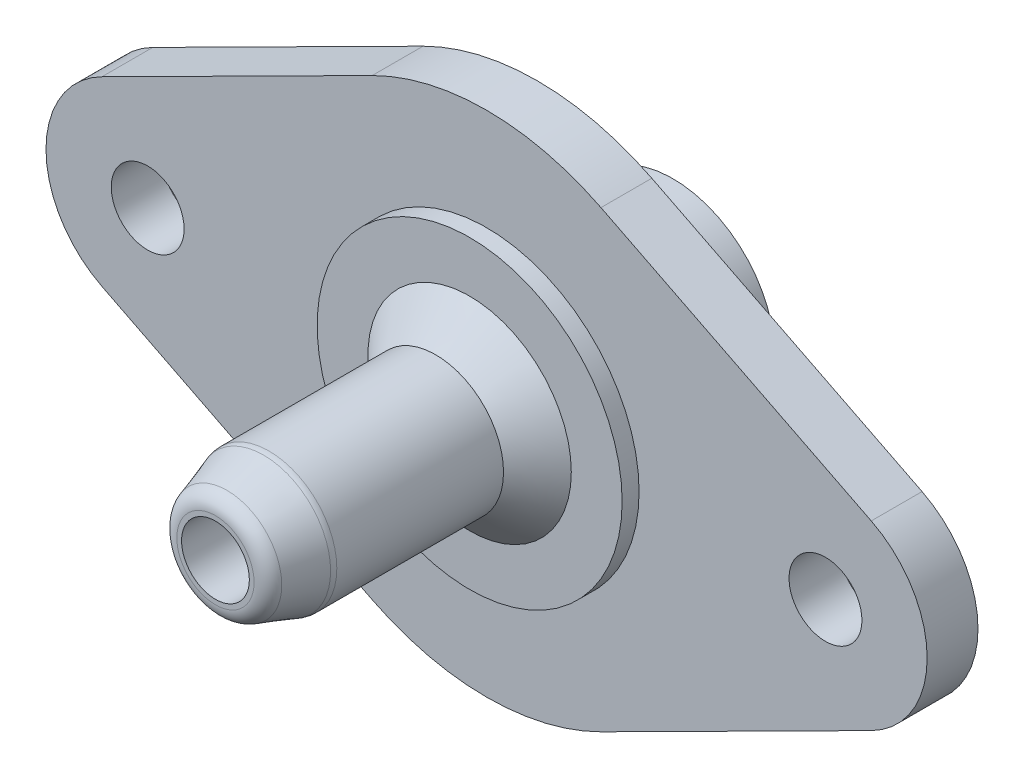
ISO-10303-21;
HEADER;
FILE_DESCRIPTION(('STEP AP214'),'2;1');
FILE_NAME('part.step','',(''),(''),'','','');
FILE_SCHEMA(('AUTOMOTIVE_DESIGN { 1 0 10303 214 1 1 1 1 }'));
ENDSEC;
DATA;
#1=APPLICATION_CONTEXT('core data for automotive mechanical design processes');
#2=APPLICATION_PROTOCOL_DEFINITION('international standard','automotive_design',2000,#1);
#3=PRODUCT_CONTEXT('',#1,'mechanical');
#4=PRODUCT('Part','Part','',(#3));
#5=PRODUCT_RELATED_PRODUCT_CATEGORY('part','',(#4));
#6=PRODUCT_DEFINITION_FORMATION('','',#4);
#7=PRODUCT_DEFINITION_CONTEXT('part definition',#1,'design');
#8=PRODUCT_DEFINITION('design','',#6,#7);
#9=PRODUCT_DEFINITION_SHAPE('','',#8);
#10=(LENGTH_UNIT() NAMED_UNIT(*) SI_UNIT(.MILLI.,.METRE.));
#11=(NAMED_UNIT(*) PLANE_ANGLE_UNIT() SI_UNIT($,.RADIAN.));
#12=(NAMED_UNIT(*) SI_UNIT($,.STERADIAN.) SOLID_ANGLE_UNIT());
#13=UNCERTAINTY_MEASURE_WITH_UNIT(LENGTH_MEASURE(1.E-05),#10,'distance_accuracy_value','');
#14=(GEOMETRIC_REPRESENTATION_CONTEXT(3) GLOBAL_UNCERTAINTY_ASSIGNED_CONTEXT((#13)) GLOBAL_UNIT_ASSIGNED_CONTEXT((#10,
#11,#12)) REPRESENTATION_CONTEXT('',''));
#15=CARTESIAN_POINT('',(0.,0.,0.));
#16=DIRECTION('',(0.,0.,1.));
#17=DIRECTION('',(1.,0.,0.));
#18=AXIS2_PLACEMENT_3D('',#15,#16,#17);
#19=CARTESIAN_POINT('',(0.,0.,0.));
#20=DIRECTION('',(0.,0.,1.));
#21=DIRECTION('',(1.,0.,0.));
#22=AXIS2_PLACEMENT_3D('',#19,#20,#21);
#23=PLANE('',#22);
#24=CARTESIAN_POINT('',(0.,0.,0.));
#25=DIRECTION('',(0.,0.,1.));
#26=DIRECTION('',(1.,0.,0.));
#27=AXIS2_PLACEMENT_3D('',#24,#25,#26);
#28=CIRCLE('',#27,6.);
#29=CARTESIAN_POINT('',(6.,0.,0.));
#30=VERTEX_POINT('',#29);
#31=EDGE_CURVE('E202',#30,#30,#28,.T.);
#32=ORIENTED_EDGE('',*,*,#31,.F.);
#33=EDGE_LOOP('',(#32));
#34=FACE_BOUND('',#33,.T.);
#35=CARTESIAN_POINT('',(0.,0.,0.));
#36=DIRECTION('',(0.,0.,1.));
#37=DIRECTION('',(1.,0.,0.));
#38=AXIS2_PLACEMENT_3D('',#35,#36,#37);
#39=CIRCLE('',#38,3.);
#40=CARTESIAN_POINT('',(3.,0.,0.));
#41=VERTEX_POINT('',#40);
#42=EDGE_CURVE('E198',#41,#41,#39,.T.);
#43=ORIENTED_EDGE('',*,*,#42,.T.);
#44=EDGE_LOOP('',(#43));
#45=FACE_BOUND('',#44,.T.);
#46=ADVANCED_FACE('F41',(#34,#45),#23,.F.);
#47=CARTESIAN_POINT('',(0.,0.,8.));
#48=DIRECTION('',(0.,0.,-1.));
#49=DIRECTION('',(-1.,0.,0.));
#50=AXIS2_PLACEMENT_3D('',#47,#48,#49);
#51=CYLINDRICAL_SURFACE('',#50,6.);
#52=CARTESIAN_POINT('',(0.,0.,8.));
#53=DIRECTION('',(0.,0.,1.));
#54=DIRECTION('',(1.,0.,0.));
#55=AXIS2_PLACEMENT_3D('',#52,#53,#54);
#56=CIRCLE('',#55,6.);
#57=CARTESIAN_POINT('',(6.,0.,8.));
#58=VERTEX_POINT('',#57);
#59=EDGE_CURVE('E203',#58,#58,#56,.T.);
#60=ORIENTED_EDGE('',*,*,#59,.F.);
#61=EDGE_LOOP('',(#60));
#62=FACE_BOUND('',#61,.T.);
#63=ORIENTED_EDGE('',*,*,#31,.T.);
#64=EDGE_LOOP('',(#63));
#65=FACE_BOUND('',#64,.T.);
#66=ADVANCED_FACE('F269',(#62,#65),#51,.T.);
#67=CARTESIAN_POINT('',(0.,0.,8.));
#68=DIRECTION('',(0.,0.,-1.));
#69=DIRECTION('',(-1.,0.,0.));
#70=AXIS2_PLACEMENT_3D('',#67,#68,#69);
#71=CYLINDRICAL_SURFACE('',#70,3.);
#72=CARTESIAN_POINT('',(0.,0.,13.));
#73=DIRECTION('',(0.,0.,-1.));
#74=DIRECTION('',(-1.,0.,0.));
#75=AXIS2_PLACEMENT_3D('',#72,#73,#74);
#76=CIRCLE('',#75,3.);
#77=CARTESIAN_POINT('',(-3.,0.,13.));
#78=VERTEX_POINT('',#77);
#79=EDGE_CURVE('E222',#78,#78,#76,.F.);
#80=ORIENTED_EDGE('',*,*,#79,.T.);
#81=EDGE_LOOP('',(#80));
#82=FACE_BOUND('',#81,.T.);
#83=ORIENTED_EDGE('',*,*,#42,.F.);
#84=EDGE_LOOP('',(#83));
#85=FACE_BOUND('',#84,.T.);
#86=ADVANCED_FACE('F275',(#82,#85),#71,.F.);
#87=CARTESIAN_POINT('',(0.,0.,12.));
#88=DIRECTION('',(0.,0.,1.));
#89=DIRECTION('',(1.,0.,0.));
#90=AXIS2_PLACEMENT_3D('',#87,#88,#89);
#91=PLANE('',#90);
#92=CARTESIAN_POINT('',(0.,0.,12.));
#93=DIRECTION('',(0.,0.,1.));
#94=DIRECTION('',(1.,0.,0.));
#95=AXIS2_PLACEMENT_3D('',#92,#93,#94);
#96=CIRCLE('',#95,6.);
#97=CARTESIAN_POINT('',(6.,0.,12.));
#98=VERTEX_POINT('',#97);
#99=EDGE_CURVE('E218',#98,#98,#96,.F.);
#100=ORIENTED_EDGE('',*,*,#99,.T.);
#101=EDGE_LOOP('',(#100));
#102=FACE_BOUND('',#101,.T.);
#103=CARTESIAN_POINT('',(0.,0.,12.));
#104=DIRECTION('',(0.,0.,1.));
#105=DIRECTION('',(1.,0.,0.));
#106=AXIS2_PLACEMENT_3D('',#103,#104,#105);
#107=CIRCLE('',#106,9.);
#108=CARTESIAN_POINT('',(9.,0.,12.));
#109=VERTEX_POINT('',#108);
#110=EDGE_CURVE('E194',#109,#109,#107,.T.);
#111=ORIENTED_EDGE('',*,*,#110,.T.);
#112=EDGE_LOOP('',(#111));
#113=FACE_BOUND('',#112,.T.);
#114=ADVANCED_FACE('F423',(#102,#113),#91,.T.);
#115=CARTESIAN_POINT('',(0.,0.,8.));
#116=DIRECTION('',(0.,0.,1.));
#117=DIRECTION('',(1.,0.,0.));
#118=AXIS2_PLACEMENT_3D('',#115,#116,#117);
#119=PLANE('',#118);
#120=ORIENTED_EDGE('',*,*,#59,.T.);
#121=EDGE_LOOP('',(#120));
#122=FACE_BOUND('',#121,.T.);
#123=CARTESIAN_POINT('',(-20.,0.,8.));
#124=DIRECTION('',(0.,0.,1.));
#125=DIRECTION('',(1.,0.,0.));
#126=AXIS2_PLACEMENT_3D('',#123,#124,#125);
#127=CIRCLE('',#126,6.);
#128=CARTESIAN_POINT('',(-22.7,5.35817132984753,8.));
#129=VERTEX_POINT('',#128);
#130=CARTESIAN_POINT('',(-22.7,-5.35817132984753,8.));
#131=VERTEX_POINT('',#130);
#132=EDGE_CURVE('E145',#129,#131,#127,.T.);
#133=ORIENTED_EDGE('',*,*,#132,.F.);
#134=DIRECTION('',(-0.893028554974588,-0.45,0.));
#135=VECTOR('',#134,1.);
#136=CARTESIAN_POINT('',(-22.7,5.35817132984753,8.));
#137=LINE('',#136,#135);
#138=CARTESIAN_POINT('',(-6.75,13.3954283246188,8.));
#139=VERTEX_POINT('',#138);
#140=EDGE_CURVE('E94',#139,#129,#137,.T.);
#141=ORIENTED_EDGE('',*,*,#140,.F.);
#142=CARTESIAN_POINT('',(0.,0.,8.));
#143=DIRECTION('',(0.,0.,1.));
#144=DIRECTION('',(1.,0.,0.));
#145=AXIS2_PLACEMENT_3D('',#142,#143,#144);
#146=CIRCLE('',#145,15.);
#147=CARTESIAN_POINT('',(6.75,13.3954283246188,8.));
#148=VERTEX_POINT('',#147);
#149=EDGE_CURVE('E88',#148,#139,#146,.T.);
#150=ORIENTED_EDGE('',*,*,#149,.F.);
#151=DIRECTION('',(-0.893028554974588,0.45,0.));
#152=VECTOR('',#151,1.);
#153=CARTESIAN_POINT('',(6.75,13.3954283246188,8.));
#154=LINE('',#153,#152);
#155=CARTESIAN_POINT('',(22.7,5.35817132984753,8.));
#156=VERTEX_POINT('',#155);
#157=EDGE_CURVE('E132',#156,#148,#154,.T.);
#158=ORIENTED_EDGE('',*,*,#157,.F.);
#159=CARTESIAN_POINT('',(20.,0.,8.));
#160=DIRECTION('',(0.,0.,1.));
#161=DIRECTION('',(1.,0.,0.));
#162=AXIS2_PLACEMENT_3D('',#159,#160,#161);
#163=CIRCLE('',#162,6.);
#164=CARTESIAN_POINT('',(22.7,-5.35817132984753,8.));
#165=VERTEX_POINT('',#164);
#166=EDGE_CURVE('E159',#165,#156,#163,.T.);
#167=ORIENTED_EDGE('',*,*,#166,.F.);
#168=DIRECTION('',(0.893028554974588,0.45,0.));
#169=VECTOR('',#168,1.);
#170=CARTESIAN_POINT('',(22.7,-5.35817132984753,8.));
#171=LINE('',#170,#169);
#172=CARTESIAN_POINT('',(6.74999999999999,-13.3954283246188,8.));
#173=VERTEX_POINT('',#172);
#174=EDGE_CURVE('E156',#173,#165,#171,.T.);
#175=ORIENTED_EDGE('',*,*,#174,.F.);
#176=CARTESIAN_POINT('',(0.,0.,8.));
#177=DIRECTION('',(0.,0.,1.));
#178=DIRECTION('',(1.,0.,0.));
#179=AXIS2_PLACEMENT_3D('',#176,#177,#178);
#180=CIRCLE('',#179,15.);
#181=CARTESIAN_POINT('',(-6.75,-13.3954283246188,8.));
#182=VERTEX_POINT('',#181);
#183=EDGE_CURVE('E153',#182,#173,#180,.T.);
#184=ORIENTED_EDGE('',*,*,#183,.F.);
#185=DIRECTION('',(0.893028554974587,-0.45,0.));
#186=VECTOR('',#185,1.);
#187=CARTESIAN_POINT('',(-22.7,-5.35817132984753,8.));
#188=LINE('',#187,#186);
#189=EDGE_CURVE('E149',#131,#182,#188,.T.);
#190=ORIENTED_EDGE('',*,*,#189,.F.);
#191=EDGE_LOOP('',(#133,#141,#150,#158,#167,#175,#184,#190));
#192=FACE_BOUND('',#191,.T.);
#193=CARTESIAN_POINT('',(20.,0.,8.));
#194=DIRECTION('',(0.,0.,1.));
#195=DIRECTION('',(1.,0.,0.));
#196=AXIS2_PLACEMENT_3D('',#193,#194,#195);
#197=CIRCLE('',#196,2.15);
#198=CARTESIAN_POINT('',(22.15,0.,8.));
#199=VERTEX_POINT('',#198);
#200=EDGE_CURVE('E515',#199,#199,#197,.T.);
#201=ORIENTED_EDGE('',*,*,#200,.T.);
#202=EDGE_LOOP('',(#201));
#203=FACE_BOUND('',#202,.T.);
#204=CARTESIAN_POINT('',(-20.,0.,8.));
#205=DIRECTION('',(0.,0.,1.));
#206=DIRECTION('',(1.,0.,0.));
#207=AXIS2_PLACEMENT_3D('',#204,#205,#206);
#208=CIRCLE('',#207,2.15);
#209=CARTESIAN_POINT('',(-17.85,0.,8.));
#210=VERTEX_POINT('',#209);
#211=EDGE_CURVE('E546',#210,#210,#208,.T.);
#212=ORIENTED_EDGE('',*,*,#211,.T.);
#213=EDGE_LOOP('',(#212));
#214=FACE_BOUND('',#213,.T.);
#215=ADVANCED_FACE('F418',(#122,#192,#203,#214),#119,.F.);
#216=CARTESIAN_POINT('',(0.,0.,12.));
#217=DIRECTION('',(0.,0.,-1.));
#218=DIRECTION('',(-1.,0.,0.));
#219=AXIS2_PLACEMENT_3D('',#216,#217,#218);
#220=CYLINDRICAL_SURFACE('',#219,9.);
#221=CARTESIAN_POINT('',(0.,0.,11.));
#222=DIRECTION('',(0.,0.,1.));
#223=DIRECTION('',(1.,0.,0.));
#224=AXIS2_PLACEMENT_3D('',#221,#222,#223);
#225=CIRCLE('',#224,9.);
#226=CARTESIAN_POINT('',(9.,0.,11.));
#227=VERTEX_POINT('',#226);
#228=EDGE_CURVE('E150',#227,#227,#225,.T.);
#229=ORIENTED_EDGE('',*,*,#228,.T.);
#230=EDGE_LOOP('',(#229));
#231=FACE_BOUND('',#230,.T.);
#232=ORIENTED_EDGE('',*,*,#110,.F.);
#233=EDGE_LOOP('',(#232));
#234=FACE_BOUND('',#233,.T.);
#235=ADVANCED_FACE('F249',(#231,#234),#220,.T.);
#236=CARTESIAN_POINT('',(0.,0.,27.));
#237=DIRECTION('',(0.,0.,1.));
#238=DIRECTION('',(1.,0.,0.));
#239=AXIS2_PLACEMENT_3D('',#236,#237,#238);
#240=PLANE('',#239);
#241=CARTESIAN_POINT('',(0.,0.,27.));
#242=DIRECTION('',(0.,0.,1.));
#243=DIRECTION('',(1.,0.,0.));
#244=AXIS2_PLACEMENT_3D('',#241,#242,#243);
#245=CIRCLE('',#244,2.27924077994386);
#246=CARTESIAN_POINT('',(2.27924077994386,0.,27.));
#247=VERTEX_POINT('',#246);
#248=EDGE_CURVE('E226',#247,#247,#245,.T.);
#249=ORIENTED_EDGE('',*,*,#248,.T.);
#250=EDGE_LOOP('',(#249));
#251=FACE_BOUND('',#250,.T.);
#252=CARTESIAN_POINT('',(0.,0.,27.));
#253=DIRECTION('',(0.,0.,1.));
#254=DIRECTION('',(1.,0.,0.));
#255=AXIS2_PLACEMENT_3D('',#252,#253,#254);
#256=CIRCLE('',#255,2.);
#257=CARTESIAN_POINT('',(2.,0.,27.));
#258=VERTEX_POINT('',#257);
#259=EDGE_CURVE('E190',#258,#258,#256,.T.);
#260=ORIENTED_EDGE('',*,*,#259,.F.);
#261=EDGE_LOOP('',(#260));
#262=FACE_BOUND('',#261,.T.);
#263=ADVANCED_FACE('F245',(#251,#262),#240,.T.);
#264=CARTESIAN_POINT('',(0.,0.,27.));
#265=DIRECTION('',(0.,0.,-1.));
#266=DIRECTION('',(-1.,0.,0.));
#267=AXIS2_PLACEMENT_3D('',#264,#265,#266);
#268=CYLINDRICAL_SURFACE('',#267,4.);
#269=CARTESIAN_POINT('',(0.,0.,23.8377223398316));
#270=DIRECTION('',(0.,0.,1.));
#271=DIRECTION('',(1.,0.,0.));
#272=AXIS2_PLACEMENT_3D('',#269,#270,#271);
#273=CIRCLE('',#272,4.);
#274=CARTESIAN_POINT('',(4.,0.,23.8377223398316));
#275=VERTEX_POINT('',#274);
#276=EDGE_CURVE('E11',#275,#275,#273,.F.);
#277=ORIENTED_EDGE('',*,*,#276,.T.);
#278=EDGE_LOOP('',(#277));
#279=FACE_BOUND('',#278,.T.);
#280=CARTESIAN_POINT('',(0.,0.,14.));
#281=DIRECTION('',(0.,0.,1.));
#282=DIRECTION('',(1.,0.,0.));
#283=AXIS2_PLACEMENT_3D('',#280,#281,#282);
#284=CIRCLE('',#283,4.);
#285=CARTESIAN_POINT('',(4.,0.,14.));
#286=VERTEX_POINT('',#285);
#287=EDGE_CURVE('E214',#286,#286,#284,.T.);
#288=ORIENTED_EDGE('',*,*,#287,.T.);
#289=EDGE_LOOP('',(#288));
#290=FACE_BOUND('',#289,.T.);
#291=ADVANCED_FACE('F248',(#279,#290),#268,.T.);
#292=CARTESIAN_POINT('',(0.,0.,27.));
#293=DIRECTION('',(0.,0.,-1.));
#294=DIRECTION('',(-1.,0.,0.));
#295=AXIS2_PLACEMENT_3D('',#292,#293,#294);
#296=CYLINDRICAL_SURFACE('',#295,2.);
#297=CARTESIAN_POINT('',(0.,0.,14.));
#298=DIRECTION('',(0.,0.,1.));
#299=DIRECTION('',(1.,0.,0.));
#300=AXIS2_PLACEMENT_3D('',#297,#298,#299);
#301=CIRCLE('',#300,2.);
#302=CARTESIAN_POINT('',(2.,0.,14.));
#303=VERTEX_POINT('',#302);
#304=EDGE_CURVE('E207',#303,#303,#301,.F.);
#305=ORIENTED_EDGE('',*,*,#304,.T.);
#306=EDGE_LOOP('',(#305));
#307=FACE_BOUND('',#306,.T.);
#308=ORIENTED_EDGE('',*,*,#259,.T.);
#309=EDGE_LOOP('',(#308));
#310=FACE_BOUND('',#309,.T.);
#311=ADVANCED_FACE('F253',(#307,#310),#296,.F.);
#312=CARTESIAN_POINT('',(0.,0.,12.));
#313=DIRECTION('',(0.,0.,-1.));
#314=DIRECTION('',(-1.,0.,0.));
#315=AXIS2_PLACEMENT_3D('',#312,#313,#314);
#316=CONICAL_SURFACE('',#315,4.00000000000003,0.785398163397453);
#317=ORIENTED_EDGE('',*,*,#304,.F.);
#318=EDGE_LOOP('',(#317));
#319=FACE_BOUND('',#318,.T.);
#320=ORIENTED_EDGE('',*,*,#79,.F.);
#321=EDGE_LOOP('',(#320));
#322=FACE_BOUND('',#321,.T.);
#323=ADVANCED_FACE('F255',(#319,#322),#316,.F.);
#324=CARTESIAN_POINT('',(0.,0.,14.));
#325=DIRECTION('',(0.,0.,-1.));
#326=DIRECTION('',(-1.,0.,0.));
#327=AXIS2_PLACEMENT_3D('',#324,#325,#326);
#328=CONICAL_SURFACE('',#327,4.,0.785398163397444);
#329=ORIENTED_EDGE('',*,*,#99,.F.);
#330=EDGE_LOOP('',(#329));
#331=FACE_BOUND('',#330,.T.);
#332=ORIENTED_EDGE('',*,*,#287,.F.);
#333=EDGE_LOOP('',(#332));
#334=FACE_BOUND('',#333,.T.);
#335=ADVANCED_FACE('F262',(#331,#334),#328,.T.);
#336=CARTESIAN_POINT('',(0.,0.,27.));
#337=DIRECTION('',(0.,0.,-1.));
#338=DIRECTION('',(-1.,0.,0.));
#339=AXIS2_PLACEMENT_3D('',#336,#337,#338);
#340=CONICAL_SURFACE('',#339,2.99999999999999,0.32175055439664);
#341=CARTESIAN_POINT('',(0.,0.,26.3162277660168));
#342=DIRECTION('',(0.,0.,1.));
#343=DIRECTION('',(1.,0.,0.));
#344=AXIS2_PLACEMENT_3D('',#341,#342,#343);
#345=CIRCLE('',#344,3.22792407799438);
#346=CARTESIAN_POINT('',(3.22792407799438,0.,26.3162277660168));
#347=VERTEX_POINT('',#346);
#348=EDGE_CURVE('E51',#347,#347,#345,.F.);
#349=ORIENTED_EDGE('',*,*,#348,.T.);
#350=EDGE_LOOP('',(#349));
#351=FACE_BOUND('',#350,.T.);
#352=CARTESIAN_POINT('',(0.,0.,24.1539501058484));
#353=DIRECTION('',(0.,0.,-1.));
#354=DIRECTION('',(-1.,0.,0.));
#355=AXIS2_PLACEMENT_3D('',#352,#353,#354);
#356=CIRCLE('',#355,3.94868329805051);
#357=CARTESIAN_POINT('',(-3.94868329805051,0.,24.1539501058484));
#358=VERTEX_POINT('',#357);
#359=EDGE_CURVE('E230',#358,#358,#356,.F.);
#360=ORIENTED_EDGE('',*,*,#359,.T.);
#361=EDGE_LOOP('',(#360));
#362=FACE_BOUND('',#361,.T.);
#363=ADVANCED_FACE('F237',(#351,#362),#340,.T.);
#364=CARTESIAN_POINT('',(0.,0.,26.));
#365=DIRECTION('',(0.,0.,1.));
#366=DIRECTION('',(1.,0.,0.));
#367=AXIS2_PLACEMENT_3D('',#364,#365,#366);
#368=TOROIDAL_SURFACE('',#367,2.27924077994386,1.);
#369=ORIENTED_EDGE('',*,*,#348,.F.);
#370=EDGE_LOOP('',(#369));
#371=FACE_BOUND('',#370,.T.);
#372=ORIENTED_EDGE('',*,*,#248,.F.);
#373=EDGE_LOOP('',(#372));
#374=FACE_BOUND('',#373,.T.);
#375=ADVANCED_FACE('F240',(#371,#374),#368,.T.);
#376=CARTESIAN_POINT('',(0.,0.,23.8377223398316));
#377=DIRECTION('',(0.,0.,1.));
#378=DIRECTION('',(1.,0.,0.));
#379=AXIS2_PLACEMENT_3D('',#376,#377,#378);
#380=TOROIDAL_SURFACE('',#379,3.,1.);
#381=ORIENTED_EDGE('',*,*,#359,.F.);
#382=EDGE_LOOP('',(#381));
#383=FACE_BOUND('',#382,.T.);
#384=ORIENTED_EDGE('',*,*,#276,.F.);
#385=EDGE_LOOP('',(#384));
#386=FACE_BOUND('',#385,.T.);
#387=ADVANCED_FACE('F43',(#383,#386),#380,.T.);
#388=CARTESIAN_POINT('',(-20.,0.,11.));
#389=DIRECTION('',(0.,0.,1.));
#390=DIRECTION('',(1.,0.,0.));
#391=AXIS2_PLACEMENT_3D('',#388,#389,#390);
#392=PLANE('',#391);
#393=CARTESIAN_POINT('',(20.,0.,11.));
#394=DIRECTION('',(0.,0.,1.));
#395=DIRECTION('',(1.,0.,0.));
#396=AXIS2_PLACEMENT_3D('',#393,#394,#395);
#397=CIRCLE('',#396,2.15);
#398=CARTESIAN_POINT('',(22.15,0.,11.));
#399=VERTEX_POINT('',#398);
#400=EDGE_CURVE('E511',#399,#399,#397,.T.);
#401=ORIENTED_EDGE('',*,*,#400,.F.);
#402=EDGE_LOOP('',(#401));
#403=FACE_BOUND('',#402,.T.);
#404=CARTESIAN_POINT('',(-20.,0.,11.));
#405=DIRECTION('',(0.,0.,1.));
#406=DIRECTION('',(1.,0.,0.));
#407=AXIS2_PLACEMENT_3D('',#404,#405,#406);
#408=CIRCLE('',#407,6.);
#409=CARTESIAN_POINT('',(-22.7,5.35817132984753,11.));
#410=VERTEX_POINT('',#409);
#411=CARTESIAN_POINT('',(-22.7,-5.35817132984753,11.));
#412=VERTEX_POINT('',#411);
#413=EDGE_CURVE('E168',#410,#412,#408,.T.);
#414=ORIENTED_EDGE('',*,*,#413,.T.);
#415=DIRECTION('',(0.893028554974587,-0.45,0.));
#416=VECTOR('',#415,1.);
#417=CARTESIAN_POINT('',(-22.7,-5.35817132984753,11.));
#418=LINE('',#417,#416);
#419=CARTESIAN_POINT('',(-6.75,-13.3954283246188,11.));
#420=VERTEX_POINT('',#419);
#421=EDGE_CURVE('E103',#412,#420,#418,.T.);
#422=ORIENTED_EDGE('',*,*,#421,.T.);
#423=CARTESIAN_POINT('',(0.,0.,11.));
#424=DIRECTION('',(0.,0.,1.));
#425=DIRECTION('',(1.,0.,0.));
#426=AXIS2_PLACEMENT_3D('',#423,#424,#425);
#427=CIRCLE('',#426,15.);
#428=CARTESIAN_POINT('',(6.74999999999999,-13.3954283246188,11.));
#429=VERTEX_POINT('',#428);
#430=EDGE_CURVE('E523',#420,#429,#427,.T.);
#431=ORIENTED_EDGE('',*,*,#430,.T.);
#432=DIRECTION('',(0.893028554974588,0.45,0.));
#433=VECTOR('',#432,1.);
#434=CARTESIAN_POINT('',(22.7,-5.35817132984753,11.));
#435=LINE('',#434,#433);
#436=CARTESIAN_POINT('',(22.7,-5.35817132984753,11.));
#437=VERTEX_POINT('',#436);
#438=EDGE_CURVE('E526',#429,#437,#435,.T.);
#439=ORIENTED_EDGE('',*,*,#438,.T.);
#440=CARTESIAN_POINT('',(20.,0.,11.));
#441=DIRECTION('',(0.,0.,1.));
#442=DIRECTION('',(1.,0.,0.));
#443=AXIS2_PLACEMENT_3D('',#440,#441,#442);
#444=CIRCLE('',#443,6.);
#445=CARTESIAN_POINT('',(22.7,5.35817132984753,11.));
#446=VERTEX_POINT('',#445);
#447=EDGE_CURVE('E123',#437,#446,#444,.T.);
#448=ORIENTED_EDGE('',*,*,#447,.T.);
#449=DIRECTION('',(-0.893028554974588,0.45,0.));
#450=VECTOR('',#449,1.);
#451=CARTESIAN_POINT('',(6.75,13.3954283246188,11.));
#452=LINE('',#451,#450);
#453=CARTESIAN_POINT('',(6.75,13.3954283246188,11.));
#454=VERTEX_POINT('',#453);
#455=EDGE_CURVE('E116',#446,#454,#452,.T.);
#456=ORIENTED_EDGE('',*,*,#455,.T.);
#457=CARTESIAN_POINT('',(0.,0.,11.));
#458=DIRECTION('',(0.,0.,1.));
#459=DIRECTION('',(1.,0.,0.));
#460=AXIS2_PLACEMENT_3D('',#457,#458,#459);
#461=CIRCLE('',#460,15.);
#462=CARTESIAN_POINT('',(-6.75,13.3954283246188,11.));
#463=VERTEX_POINT('',#462);
#464=EDGE_CURVE('E121',#454,#463,#461,.T.);
#465=ORIENTED_EDGE('',*,*,#464,.T.);
#466=DIRECTION('',(-0.893028554974588,-0.45,0.));
#467=VECTOR('',#466,1.);
#468=CARTESIAN_POINT('',(-22.7,5.35817132984753,11.));
#469=LINE('',#468,#467);
#470=EDGE_CURVE('E59',#463,#410,#469,.T.);
#471=ORIENTED_EDGE('',*,*,#470,.T.);
#472=EDGE_LOOP('',(#414,#422,#431,#439,#448,#456,#465,#471));
#473=FACE_BOUND('',#472,.T.);
#474=ORIENTED_EDGE('',*,*,#228,.F.);
#475=EDGE_LOOP('',(#474));
#476=FACE_BOUND('',#475,.T.);
#477=CARTESIAN_POINT('',(-20.,0.,11.));
#478=DIRECTION('',(0.,0.,1.));
#479=DIRECTION('',(1.,0.,0.));
#480=AXIS2_PLACEMENT_3D('',#477,#478,#479);
#481=CIRCLE('',#480,2.15);
#482=CARTESIAN_POINT('',(-17.85,0.,11.));
#483=VERTEX_POINT('',#482);
#484=EDGE_CURVE('E549',#483,#483,#481,.T.);
#485=ORIENTED_EDGE('',*,*,#484,.F.);
#486=EDGE_LOOP('',(#485));
#487=FACE_BOUND('',#486,.T.);
#488=ADVANCED_FACE('F118',(#403,#473,#476,#487),#392,.T.);
#489=CARTESIAN_POINT('',(-20.,0.,11.));
#490=DIRECTION('',(0.,0.,-1.));
#491=DIRECTION('',(-1.,0.,0.));
#492=AXIS2_PLACEMENT_3D('',#489,#490,#491);
#493=CYLINDRICAL_SURFACE('',#492,6.);
#494=ORIENTED_EDGE('',*,*,#132,.T.);
#495=DIRECTION('',(0.,0.,-1.));
#496=VECTOR('',#495,1.);
#497=CARTESIAN_POINT('',(-22.7,-5.35817132984753,11.));
#498=LINE('',#497,#496);
#499=EDGE_CURVE('E187',#412,#131,#498,.T.);
#500=ORIENTED_EDGE('',*,*,#499,.F.);
#501=ORIENTED_EDGE('',*,*,#413,.F.);
#502=DIRECTION('',(0.,0.,-1.));
#503=VECTOR('',#502,1.);
#504=CARTESIAN_POINT('',(-22.7,5.35817132984753,11.));
#505=LINE('',#504,#503);
#506=EDGE_CURVE('E141',#410,#129,#505,.T.);
#507=ORIENTED_EDGE('',*,*,#506,.T.);
#508=EDGE_LOOP('',(#494,#500,#501,#507));
#509=FACE_BOUND('',#508,.T.);
#510=ADVANCED_FACE('F318',(#509),#493,.T.);
#511=CARTESIAN_POINT('',(-22.7,-5.35817132984753,11.));
#512=DIRECTION('',(0.45,0.893028554974588,0.));
#513=DIRECTION('',(-0.893028554974588,0.45,0.));
#514=AXIS2_PLACEMENT_3D('',#511,#512,#513);
#515=PLANE('',#514);
#516=ORIENTED_EDGE('',*,*,#189,.T.);
#517=DIRECTION('',(0.,0.,-1.));
#518=VECTOR('',#517,1.);
#519=CARTESIAN_POINT('',(-6.75,-13.3954283246188,11.));
#520=LINE('',#519,#518);
#521=EDGE_CURVE('E183',#420,#182,#520,.T.);
#522=ORIENTED_EDGE('',*,*,#521,.F.);
#523=ORIENTED_EDGE('',*,*,#421,.F.);
#524=ORIENTED_EDGE('',*,*,#499,.T.);
#525=EDGE_LOOP('',(#516,#522,#523,#524));
#526=FACE_BOUND('',#525,.T.);
#527=ADVANCED_FACE('F327',(#526),#515,.F.);
#528=CARTESIAN_POINT('',(0.,0.,11.));
#529=DIRECTION('',(0.,0.,-1.));
#530=DIRECTION('',(-1.,0.,0.));
#531=AXIS2_PLACEMENT_3D('',#528,#529,#530);
#532=CYLINDRICAL_SURFACE('',#531,15.);
#533=ORIENTED_EDGE('',*,*,#183,.T.);
#534=DIRECTION('',(0.,0.,-1.));
#535=VECTOR('',#534,1.);
#536=CARTESIAN_POINT('',(6.74999999999999,-13.3954283246188,11.));
#537=LINE('',#536,#535);
#538=EDGE_CURVE('E179',#429,#173,#537,.T.);
#539=ORIENTED_EDGE('',*,*,#538,.F.);
#540=ORIENTED_EDGE('',*,*,#430,.F.);
#541=ORIENTED_EDGE('',*,*,#521,.T.);
#542=EDGE_LOOP('',(#533,#539,#540,#541));
#543=FACE_BOUND('',#542,.T.);
#544=ADVANCED_FACE('F334',(#543),#532,.T.);
#545=CARTESIAN_POINT('',(22.7,-5.35817132984753,11.));
#546=DIRECTION('',(-0.45,0.893028554974588,0.));
#547=DIRECTION('',(-0.893028554974588,-0.45,0.));
#548=AXIS2_PLACEMENT_3D('',#545,#546,#547);
#549=PLANE('',#548);
#550=ORIENTED_EDGE('',*,*,#174,.T.);
#551=DIRECTION('',(0.,0.,-1.));
#552=VECTOR('',#551,1.);
#553=CARTESIAN_POINT('',(22.7,-5.35817132984753,11.));
#554=LINE('',#553,#552);
#555=EDGE_CURVE('E175',#437,#165,#554,.T.);
#556=ORIENTED_EDGE('',*,*,#555,.F.);
#557=ORIENTED_EDGE('',*,*,#438,.F.);
#558=ORIENTED_EDGE('',*,*,#538,.T.);
#559=EDGE_LOOP('',(#550,#556,#557,#558));
#560=FACE_BOUND('',#559,.T.);
#561=ADVANCED_FACE('F341',(#560),#549,.F.);
#562=CARTESIAN_POINT('',(20.,0.,11.));
#563=DIRECTION('',(0.,0.,-1.));
#564=DIRECTION('',(-1.,0.,0.));
#565=AXIS2_PLACEMENT_3D('',#562,#563,#564);
#566=CYLINDRICAL_SURFACE('',#565,6.);
#567=ORIENTED_EDGE('',*,*,#166,.T.);
#568=DIRECTION('',(0.,0.,-1.));
#569=VECTOR('',#568,1.);
#570=CARTESIAN_POINT('',(22.7,5.35817132984753,11.));
#571=LINE('',#570,#569);
#572=EDGE_CURVE('E134',#446,#156,#571,.T.);
#573=ORIENTED_EDGE('',*,*,#572,.F.);
#574=ORIENTED_EDGE('',*,*,#447,.F.);
#575=ORIENTED_EDGE('',*,*,#555,.T.);
#576=EDGE_LOOP('',(#567,#573,#574,#575));
#577=FACE_BOUND('',#576,.T.);
#578=ADVANCED_FACE('F349',(#577),#566,.T.);
#579=CARTESIAN_POINT('',(6.75,13.3954283246188,11.));
#580=DIRECTION('',(-0.45,-0.893028554974588,0.));
#581=DIRECTION('',(0.893028554974588,-0.45,0.));
#582=AXIS2_PLACEMENT_3D('',#579,#580,#581);
#583=PLANE('',#582);
#584=ORIENTED_EDGE('',*,*,#157,.T.);
#585=DIRECTION('',(0.,0.,-1.));
#586=VECTOR('',#585,1.);
#587=CARTESIAN_POINT('',(6.75,13.3954283246188,11.));
#588=LINE('',#587,#586);
#589=EDGE_CURVE('E129',#454,#148,#588,.T.);
#590=ORIENTED_EDGE('',*,*,#589,.F.);
#591=ORIENTED_EDGE('',*,*,#455,.F.);
#592=ORIENTED_EDGE('',*,*,#572,.T.);
#593=EDGE_LOOP('',(#584,#590,#591,#592));
#594=FACE_BOUND('',#593,.T.);
#595=ADVANCED_FACE('F130',(#594),#583,.F.);
#596=CARTESIAN_POINT('',(0.,0.,11.));
#597=DIRECTION('',(0.,0.,-1.));
#598=DIRECTION('',(-1.,0.,0.));
#599=AXIS2_PLACEMENT_3D('',#596,#597,#598);
#600=CYLINDRICAL_SURFACE('',#599,15.);
#601=ORIENTED_EDGE('',*,*,#149,.T.);
#602=DIRECTION('',(0.,0.,-1.));
#603=VECTOR('',#602,1.);
#604=CARTESIAN_POINT('',(-6.75,13.3954283246188,11.));
#605=LINE('',#604,#603);
#606=EDGE_CURVE('E135',#463,#139,#605,.T.);
#607=ORIENTED_EDGE('',*,*,#606,.F.);
#608=ORIENTED_EDGE('',*,*,#464,.F.);
#609=ORIENTED_EDGE('',*,*,#589,.T.);
#610=EDGE_LOOP('',(#601,#607,#608,#609));
#611=FACE_BOUND('',#610,.T.);
#612=ADVANCED_FACE('F137',(#611),#600,.T.);
#613=CARTESIAN_POINT('',(-22.7,5.35817132984753,11.));
#614=DIRECTION('',(0.45,-0.893028554974587,0.));
#615=DIRECTION('',(0.893028554974588,0.45,0.));
#616=AXIS2_PLACEMENT_3D('',#613,#614,#615);
#617=PLANE('',#616);
#618=ORIENTED_EDGE('',*,*,#140,.T.);
#619=ORIENTED_EDGE('',*,*,#506,.F.);
#620=ORIENTED_EDGE('',*,*,#470,.F.);
#621=ORIENTED_EDGE('',*,*,#606,.T.);
#622=EDGE_LOOP('',(#618,#619,#620,#621));
#623=FACE_BOUND('',#622,.T.);
#624=ADVANCED_FACE('F370',(#623),#617,.F.);
#625=CARTESIAN_POINT('',(20.,0.,11.));
#626=DIRECTION('',(0.,0.,-1.));
#627=DIRECTION('',(-1.,0.,0.));
#628=AXIS2_PLACEMENT_3D('',#625,#626,#627);
#629=CYLINDRICAL_SURFACE('',#628,2.15);
#630=ORIENTED_EDGE('',*,*,#400,.T.);
#631=EDGE_LOOP('',(#630));
#632=FACE_BOUND('',#631,.T.);
#633=ORIENTED_EDGE('',*,*,#200,.F.);
#634=EDGE_LOOP('',(#633));
#635=FACE_BOUND('',#634,.T.);
#636=ADVANCED_FACE('F377',(#632,#635),#629,.F.);
#637=CARTESIAN_POINT('',(-20.,0.,11.));
#638=DIRECTION('',(0.,0.,-1.));
#639=DIRECTION('',(-1.,0.,0.));
#640=AXIS2_PLACEMENT_3D('',#637,#638,#639);
#641=CYLINDRICAL_SURFACE('',#640,2.15);
#642=ORIENTED_EDGE('',*,*,#484,.T.);
#643=EDGE_LOOP('',(#642));
#644=FACE_BOUND('',#643,.T.);
#645=ORIENTED_EDGE('',*,*,#211,.F.);
#646=EDGE_LOOP('',(#645));
#647=FACE_BOUND('',#646,.T.);
#648=ADVANCED_FACE('F384',(#644,#647),#641,.F.);
#649=CLOSED_SHELL('',(#46,#66,#86,#114,#215,#235,#263,#291,#311,#323,#335,#363,#375,#387,#488,
#510,#527,#544,#561,#578,#595,#612,#624,#636,#648));
#650=MANIFOLD_SOLID_BREP('B2',#649);
#651=ADVANCED_BREP_SHAPE_REPRESENTATION('',(#18,#650),#14);
#652=SHAPE_DEFINITION_REPRESENTATION(#9,#651);
ENDSEC;
END-ISO-10303-21;
